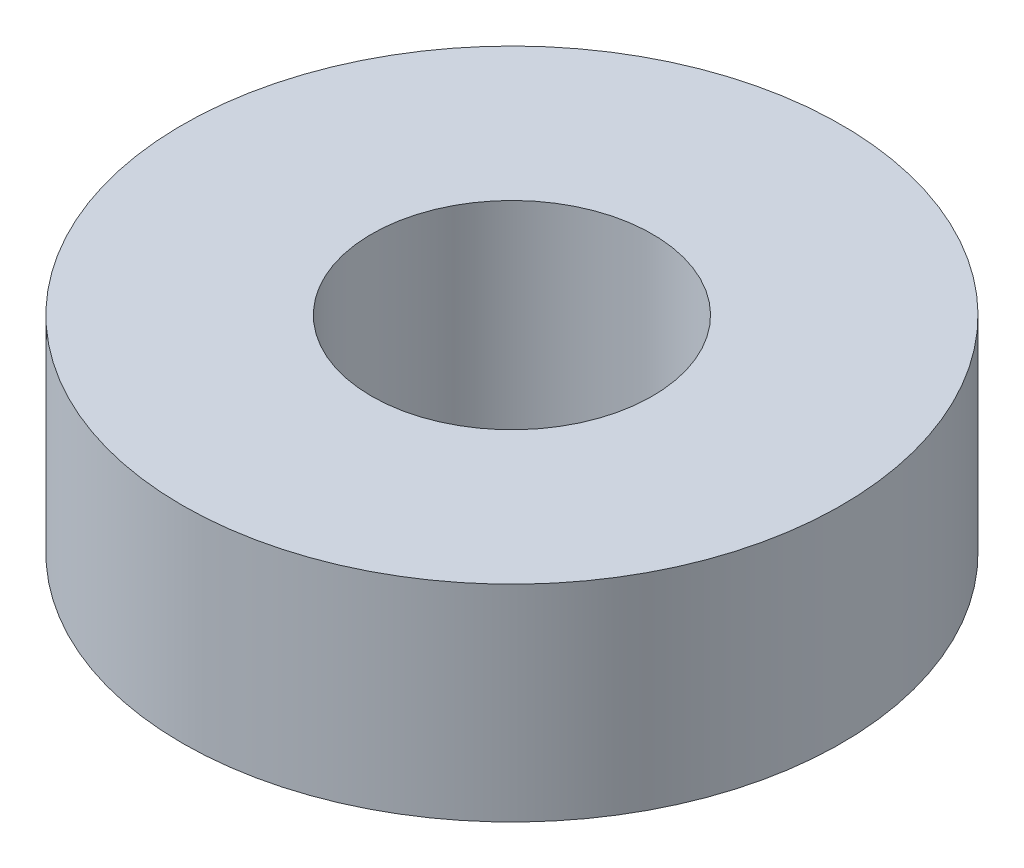
ISO-10303-21;
HEADER;
FILE_DESCRIPTION(('STEP AP214'),'2;1');
FILE_NAME('part.step','',(''),(''),'','','');
FILE_SCHEMA(('AUTOMOTIVE_DESIGN { 1 0 10303 214 1 1 1 1 }'));
ENDSEC;
DATA;
#1=APPLICATION_CONTEXT('core data for automotive mechanical design processes');
#2=APPLICATION_PROTOCOL_DEFINITION('international standard','automotive_design',2000,#1);
#3=PRODUCT_CONTEXT('',#1,'mechanical');
#4=PRODUCT('Part','Part','',(#3));
#5=PRODUCT_RELATED_PRODUCT_CATEGORY('part','',(#4));
#6=PRODUCT_DEFINITION_FORMATION('','',#4);
#7=PRODUCT_DEFINITION_CONTEXT('part definition',#1,'design');
#8=PRODUCT_DEFINITION('design','',#6,#7);
#9=PRODUCT_DEFINITION_SHAPE('','',#8);
#10=(LENGTH_UNIT() NAMED_UNIT(*) SI_UNIT(.MILLI.,.METRE.));
#11=(NAMED_UNIT(*) PLANE_ANGLE_UNIT() SI_UNIT($,.RADIAN.));
#12=(NAMED_UNIT(*) SI_UNIT($,.STERADIAN.) SOLID_ANGLE_UNIT());
#13=UNCERTAINTY_MEASURE_WITH_UNIT(LENGTH_MEASURE(1.E-05),#10,'distance_accuracy_value','');
#14=(GEOMETRIC_REPRESENTATION_CONTEXT(3) GLOBAL_UNCERTAINTY_ASSIGNED_CONTEXT((#13)) GLOBAL_UNIT_ASSIGNED_CONTEXT((#10,
#11,#12)) REPRESENTATION_CONTEXT('',''));
#15=CARTESIAN_POINT('',(0.,0.,0.));
#16=DIRECTION('',(0.,0.,1.));
#17=DIRECTION('',(1.,0.,0.));
#18=AXIS2_PLACEMENT_3D('',#15,#16,#17);
#19=CARTESIAN_POINT('',(0.,11.,0.));
#20=DIRECTION('',(0.,1.,0.));
#21=DIRECTION('',(0.,0.,1.));
#22=AXIS2_PLACEMENT_3D('',#19,#20,#21);
#23=PLANE('',#22);
#24=CARTESIAN_POINT('',(0.,11.,0.));
#25=DIRECTION('',(0.,1.,0.));
#26=DIRECTION('',(0.,0.,1.));
#27=AXIS2_PLACEMENT_3D('',#24,#25,#26);
#28=CIRCLE('',#27,17.6);
#29=CARTESIAN_POINT('',(0.,11.,17.6));
#30=VERTEX_POINT('',#29);
#31=EDGE_CURVE('E10',#30,#30,#28,.T.);
#32=ORIENTED_EDGE('',*,*,#31,.T.);
#33=EDGE_LOOP('',(#32));
#34=FACE_BOUND('',#33,.T.);
#35=CARTESIAN_POINT('',(0.,11.,0.));
#36=DIRECTION('',(0.,1.,0.));
#37=DIRECTION('',(0.,0.,1.));
#38=AXIS2_PLACEMENT_3D('',#35,#36,#37);
#39=CIRCLE('',#38,7.5);
#40=CARTESIAN_POINT('',(0.,11.,7.5));
#41=VERTEX_POINT('',#40);
#42=EDGE_CURVE('E50',#41,#41,#39,.T.);
#43=ORIENTED_EDGE('',*,*,#42,.F.);
#44=EDGE_LOOP('',(#43));
#45=FACE_BOUND('',#44,.T.);
#46=ADVANCED_FACE('F37',(#34,#45),#23,.T.);
#47=CARTESIAN_POINT('',(0.,0.,0.));
#48=DIRECTION('',(0.,1.,0.));
#49=DIRECTION('',(0.,0.,1.));
#50=AXIS2_PLACEMENT_3D('',#47,#48,#49);
#51=PLANE('',#50);
#52=CARTESIAN_POINT('',(0.,0.,0.));
#53=DIRECTION('',(0.,1.,0.));
#54=DIRECTION('',(0.,0.,1.));
#55=AXIS2_PLACEMENT_3D('',#52,#53,#54);
#56=CIRCLE('',#55,17.6);
#57=CARTESIAN_POINT('',(0.,0.,17.6));
#58=VERTEX_POINT('',#57);
#59=EDGE_CURVE('E41',#58,#58,#56,.T.);
#60=ORIENTED_EDGE('',*,*,#59,.F.);
#61=EDGE_LOOP('',(#60));
#62=FACE_BOUND('',#61,.T.);
#63=CARTESIAN_POINT('',(0.,0.,0.));
#64=DIRECTION('',(0.,1.,0.));
#65=DIRECTION('',(0.,0.,1.));
#66=AXIS2_PLACEMENT_3D('',#63,#64,#65);
#67=CIRCLE('',#66,7.5);
#68=CARTESIAN_POINT('',(0.,0.,7.5));
#69=VERTEX_POINT('',#68);
#70=EDGE_CURVE('E52',#69,#69,#67,.T.);
#71=ORIENTED_EDGE('',*,*,#70,.T.);
#72=EDGE_LOOP('',(#71));
#73=FACE_BOUND('',#72,.T.);
#74=ADVANCED_FACE('F64',(#62,#73),#51,.F.);
#75=CARTESIAN_POINT('',(0.,11.,0.));
#76=DIRECTION('',(0.,-1.,0.));
#77=DIRECTION('',(0.,0.,-1.));
#78=AXIS2_PLACEMENT_3D('',#75,#76,#77);
#79=CYLINDRICAL_SURFACE('',#78,17.6);
#80=ORIENTED_EDGE('',*,*,#31,.F.);
#81=EDGE_LOOP('',(#80));
#82=FACE_BOUND('',#81,.T.);
#83=ORIENTED_EDGE('',*,*,#59,.T.);
#84=EDGE_LOOP('',(#83));
#85=FACE_BOUND('',#84,.T.);
#86=ADVANCED_FACE('F39',(#82,#85),#79,.T.);
#87=CARTESIAN_POINT('',(0.,11.,0.));
#88=DIRECTION('',(0.,-1.,0.));
#89=DIRECTION('',(0.,0.,-1.));
#90=AXIS2_PLACEMENT_3D('',#87,#88,#89);
#91=CYLINDRICAL_SURFACE('',#90,7.5);
#92=ORIENTED_EDGE('',*,*,#42,.T.);
#93=EDGE_LOOP('',(#92));
#94=FACE_BOUND('',#93,.T.);
#95=ORIENTED_EDGE('',*,*,#70,.F.);
#96=EDGE_LOOP('',(#95));
#97=FACE_BOUND('',#96,.T.);
#98=ADVANCED_FACE('F60',(#94,#97),#91,.F.);
#99=CLOSED_SHELL('',(#46,#74,#86,#98));
#100=MANIFOLD_SOLID_BREP('B2',#99);
#101=ADVANCED_BREP_SHAPE_REPRESENTATION('',(#18,#100),#14);
#102=SHAPE_DEFINITION_REPRESENTATION(#9,#101);
ENDSEC;
END-ISO-10303-21;
